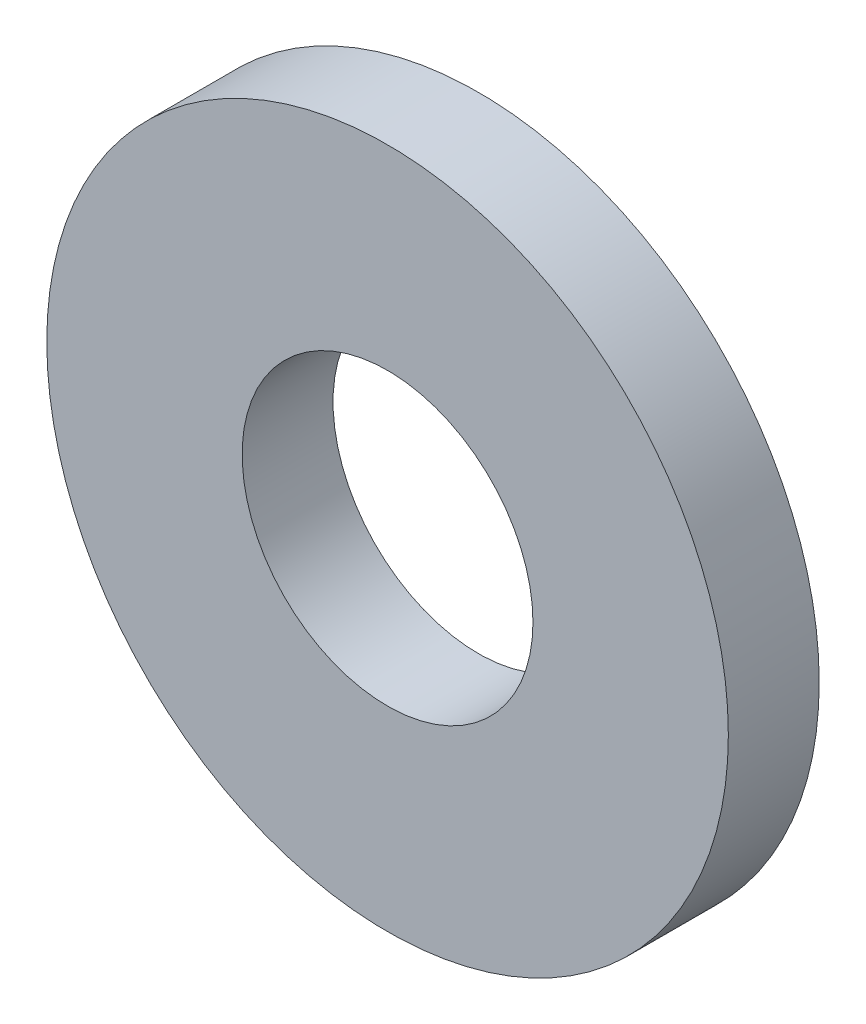
ISO-10303-21;
HEADER;
FILE_DESCRIPTION(('STEP AP214'),'2;1');
FILE_NAME('part.step','',(''),(''),'','','');
FILE_SCHEMA(('AUTOMOTIVE_DESIGN { 1 0 10303 214 1 1 1 1 }'));
ENDSEC;
DATA;
#1=APPLICATION_CONTEXT('core data for automotive mechanical design processes');
#2=APPLICATION_PROTOCOL_DEFINITION('international standard','automotive_design',2000,#1);
#3=PRODUCT_CONTEXT('',#1,'mechanical');
#4=PRODUCT('Part','Part','',(#3));
#5=PRODUCT_RELATED_PRODUCT_CATEGORY('part','',(#4));
#6=PRODUCT_DEFINITION_FORMATION('','',#4);
#7=PRODUCT_DEFINITION_CONTEXT('part definition',#1,'design');
#8=PRODUCT_DEFINITION('design','',#6,#7);
#9=PRODUCT_DEFINITION_SHAPE('','',#8);
#10=(LENGTH_UNIT() NAMED_UNIT(*) SI_UNIT(.MILLI.,.METRE.));
#11=(NAMED_UNIT(*) PLANE_ANGLE_UNIT() SI_UNIT($,.RADIAN.));
#12=(NAMED_UNIT(*) SI_UNIT($,.STERADIAN.) SOLID_ANGLE_UNIT());
#13=UNCERTAINTY_MEASURE_WITH_UNIT(LENGTH_MEASURE(1.E-05),#10,'distance_accuracy_value','');
#14=(GEOMETRIC_REPRESENTATION_CONTEXT(3) GLOBAL_UNCERTAINTY_ASSIGNED_CONTEXT((#13)) GLOBAL_UNIT_ASSIGNED_CONTEXT((#10,
#11,#12)) REPRESENTATION_CONTEXT('',''));
#15=CARTESIAN_POINT('',(0.,0.,0.));
#16=DIRECTION('',(0.,0.,1.));
#17=DIRECTION('',(1.,0.,0.));
#18=AXIS2_PLACEMENT_3D('',#15,#16,#17);
#19=CARTESIAN_POINT('',(0.,0.,2.54));
#20=DIRECTION('',(0.,0.,-1.));
#21=DIRECTION('',(-1.,0.,0.));
#22=AXIS2_PLACEMENT_3D('',#19,#20,#21);
#23=CYLINDRICAL_SURFACE('',#22,9.525);
#24=CARTESIAN_POINT('',(0.,0.,2.54));
#25=DIRECTION('',(0.,0.,1.));
#26=DIRECTION('',(1.,0.,0.));
#27=AXIS2_PLACEMENT_3D('',#24,#25,#26);
#28=CIRCLE('',#27,9.525);
#29=CARTESIAN_POINT('',(9.525,0.,2.54));
#30=VERTEX_POINT('',#29);
#31=EDGE_CURVE('E10',#30,#30,#28,.T.);
#32=ORIENTED_EDGE('',*,*,#31,.F.);
#33=EDGE_LOOP('',(#32));
#34=FACE_BOUND('',#33,.T.);
#35=CARTESIAN_POINT('',(0.,0.,0.));
#36=DIRECTION('',(0.,0.,1.));
#37=DIRECTION('',(1.,0.,0.));
#38=AXIS2_PLACEMENT_3D('',#35,#36,#37);
#39=CIRCLE('',#38,9.525);
#40=CARTESIAN_POINT('',(9.525,0.,0.));
#41=VERTEX_POINT('',#40);
#42=EDGE_CURVE('E46',#41,#41,#39,.T.);
#43=ORIENTED_EDGE('',*,*,#42,.T.);
#44=EDGE_LOOP('',(#43));
#45=FACE_BOUND('',#44,.T.);
#46=ADVANCED_FACE('F43',(#34,#45),#23,.T.);
#47=CARTESIAN_POINT('',(0.,0.,2.54));
#48=DIRECTION('',(0.,0.,1.));
#49=DIRECTION('',(1.,0.,0.));
#50=AXIS2_PLACEMENT_3D('',#47,#48,#49);
#51=PLANE('',#50);
#52=CARTESIAN_POINT('',(0.,0.,2.54));
#53=DIRECTION('',(0.,0.,1.));
#54=DIRECTION('',(1.,0.,0.));
#55=AXIS2_PLACEMENT_3D('',#52,#53,#54);
#56=CIRCLE('',#55,4.064);
#57=CARTESIAN_POINT('',(4.064,0.,2.54));
#58=VERTEX_POINT('',#57);
#59=EDGE_CURVE('E57',#58,#58,#56,.T.);
#60=ORIENTED_EDGE('',*,*,#59,.F.);
#61=EDGE_LOOP('',(#60));
#62=FACE_BOUND('',#61,.T.);
#63=ORIENTED_EDGE('',*,*,#31,.T.);
#64=EDGE_LOOP('',(#63));
#65=FACE_BOUND('',#64,.T.);
#66=ADVANCED_FACE('F74',(#62,#65),#51,.T.);
#67=CARTESIAN_POINT('',(0.,0.,0.));
#68=DIRECTION('',(0.,0.,1.));
#69=DIRECTION('',(1.,0.,0.));
#70=AXIS2_PLACEMENT_3D('',#67,#68,#69);
#71=PLANE('',#70);
#72=CARTESIAN_POINT('',(0.,0.,0.));
#73=DIRECTION('',(0.,0.,1.));
#74=DIRECTION('',(1.,0.,0.));
#75=AXIS2_PLACEMENT_3D('',#72,#73,#74);
#76=CIRCLE('',#75,4.064);
#77=CARTESIAN_POINT('',(4.064,0.,0.));
#78=VERTEX_POINT('',#77);
#79=EDGE_CURVE('E55',#78,#78,#76,.T.);
#80=ORIENTED_EDGE('',*,*,#79,.T.);
#81=EDGE_LOOP('',(#80));
#82=FACE_BOUND('',#81,.T.);
#83=ORIENTED_EDGE('',*,*,#42,.F.);
#84=EDGE_LOOP('',(#83));
#85=FACE_BOUND('',#84,.T.);
#86=ADVANCED_FACE('F65',(#82,#85),#71,.F.);
#87=CARTESIAN_POINT('',(0.,0.,0.));
#88=DIRECTION('',(0.,0.,1.));
#89=DIRECTION('',(1.,0.,0.));
#90=AXIS2_PLACEMENT_3D('',#87,#88,#89);
#91=CYLINDRICAL_SURFACE('',#90,4.064);
#92=ORIENTED_EDGE('',*,*,#79,.F.);
#93=EDGE_LOOP('',(#92));
#94=FACE_BOUND('',#93,.T.);
#95=ORIENTED_EDGE('',*,*,#59,.T.);
#96=EDGE_LOOP('',(#95));
#97=FACE_BOUND('',#96,.T.);
#98=ADVANCED_FACE('F68',(#94,#97),#91,.F.);
#99=CLOSED_SHELL('',(#46,#66,#86,#98));
#100=MANIFOLD_SOLID_BREP('B2',#99);
#101=ADVANCED_BREP_SHAPE_REPRESENTATION('',(#18,#100),#14);
#102=SHAPE_DEFINITION_REPRESENTATION(#9,#101);
ENDSEC;
END-ISO-10303-21;
